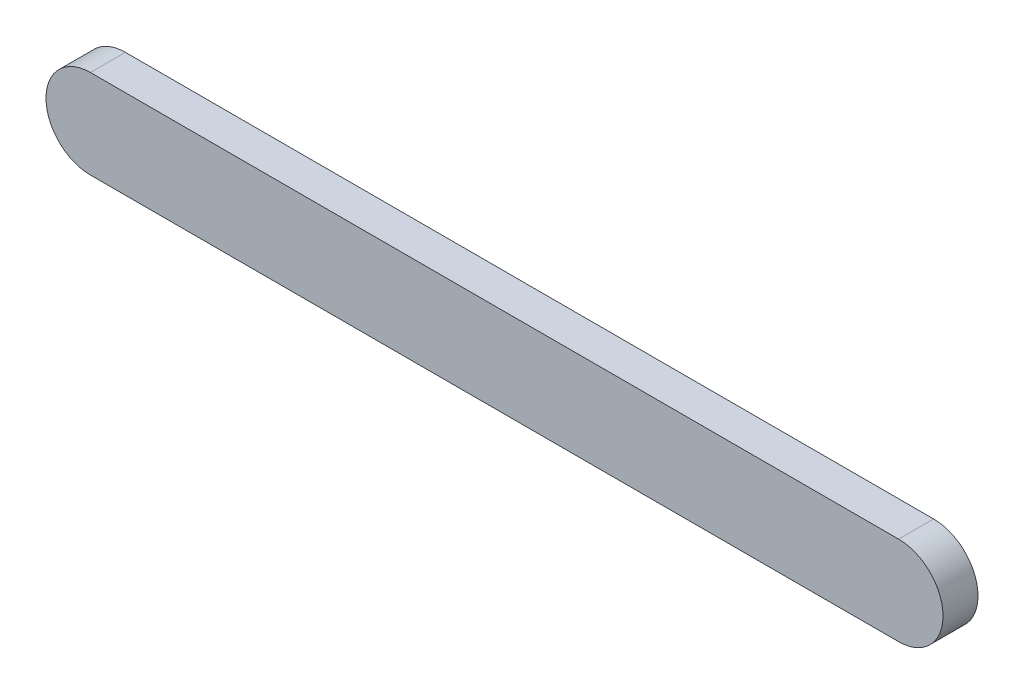
ISO-10303-21;
HEADER;
FILE_DESCRIPTION(('STEP AP214'),'2;1');
FILE_NAME('part.step','',(''),(''),'','','');
FILE_SCHEMA(('AUTOMOTIVE_DESIGN { 1 0 10303 214 1 1 1 1 }'));
ENDSEC;
DATA;
#1=APPLICATION_CONTEXT('core data for automotive mechanical design processes');
#2=APPLICATION_PROTOCOL_DEFINITION('international standard','automotive_design',2000,#1);
#3=PRODUCT_CONTEXT('',#1,'mechanical');
#4=PRODUCT('Part','Part','',(#3));
#5=PRODUCT_RELATED_PRODUCT_CATEGORY('part','',(#4));
#6=PRODUCT_DEFINITION_FORMATION('','',#4);
#7=PRODUCT_DEFINITION_CONTEXT('part definition',#1,'design');
#8=PRODUCT_DEFINITION('design','',#6,#7);
#9=PRODUCT_DEFINITION_SHAPE('','',#8);
#10=(LENGTH_UNIT() NAMED_UNIT(*) SI_UNIT(.MILLI.,.METRE.));
#11=(NAMED_UNIT(*) PLANE_ANGLE_UNIT() SI_UNIT($,.RADIAN.));
#12=(NAMED_UNIT(*) SI_UNIT($,.STERADIAN.) SOLID_ANGLE_UNIT());
#13=UNCERTAINTY_MEASURE_WITH_UNIT(LENGTH_MEASURE(1.E-05),#10,'distance_accuracy_value','');
#14=(GEOMETRIC_REPRESENTATION_CONTEXT(3) GLOBAL_UNCERTAINTY_ASSIGNED_CONTEXT((#13)) GLOBAL_UNIT_ASSIGNED_CONTEXT((#10,
#11,#12)) REPRESENTATION_CONTEXT('',''));
#15=CARTESIAN_POINT('',(0.,0.,0.));
#16=DIRECTION('',(0.,0.,1.));
#17=DIRECTION('',(1.,0.,0.));
#18=AXIS2_PLACEMENT_3D('',#15,#16,#17);
#19=CARTESIAN_POINT('',(132.21648436,97.09550304,0.));
#20=DIRECTION('',(0.,1.,0.));
#21=DIRECTION('',(1.,0.,0.));
#22=AXIS2_PLACEMENT_3D('',#19,#20,#21);
#23=PLANE('',#22);
#24=DIRECTION('',(1.,0.,0.));
#25=VECTOR('',#24,1.);
#26=CARTESIAN_POINT('',(132.21648436,97.09550304,0.1999996));
#27=LINE('',#26,#25);
#28=CARTESIAN_POINT('',(132.21648436,97.09550304,0.1999996));
#29=VERTEX_POINT('',#28);
#30=CARTESIAN_POINT('',(136.83849696,97.09550304,0.1999996));
#31=VERTEX_POINT('',#30);
#32=EDGE_CURVE('E11',#29,#31,#27,.T.);
#33=ORIENTED_EDGE('',*,*,#32,.F.);
#34=DIRECTION('',(0.,0.,1.));
#35=VECTOR('',#34,1.);
#36=CARTESIAN_POINT('',(132.21648436,97.09550304,0.));
#37=LINE('',#36,#35);
#38=CARTESIAN_POINT('',(132.21648436,97.09550304,0.));
#39=VERTEX_POINT('',#38);
#40=EDGE_CURVE('E24',#39,#29,#37,.T.);
#41=ORIENTED_EDGE('',*,*,#40,.F.);
#42=DIRECTION('',(1.,0.,0.));
#43=VECTOR('',#42,1.);
#44=CARTESIAN_POINT('',(132.21648436,97.09550304,0.));
#45=LINE('',#44,#43);
#46=CARTESIAN_POINT('',(136.83849696,97.09550304,0.));
#47=VERTEX_POINT('',#46);
#48=EDGE_CURVE('E75',#39,#47,#45,.T.);
#49=ORIENTED_EDGE('',*,*,#48,.T.);
#50=DIRECTION('',(0.,0.,1.));
#51=VECTOR('',#50,1.);
#52=CARTESIAN_POINT('',(136.83849696,97.09550304,0.));
#53=LINE('',#52,#51);
#54=EDGE_CURVE('E37',#47,#31,#53,.T.);
#55=ORIENTED_EDGE('',*,*,#54,.T.);
#56=EDGE_LOOP('',(#33,#41,#49,#55));
#57=FACE_BOUND('',#56,.T.);
#58=ADVANCED_FACE('F17',(#57),#23,.F.);
#59=CARTESIAN_POINT('',(136.83849696,97.34950304,0.));
#60=DIRECTION('',(0.,0.,-1.));
#61=DIRECTION('',(-1.11896493820492E-13,-1.,0.));
#62=AXIS2_PLACEMENT_3D('',#59,#60,#61);
#63=CYLINDRICAL_SURFACE('',#62,0.253999999999995);
#64=CARTESIAN_POINT('',(136.83849696,97.34950304,0.1999996));
#65=DIRECTION('',(0.,0.,1.));
#66=DIRECTION('',(-1.11896493820492E-13,-1.,0.));
#67=AXIS2_PLACEMENT_3D('',#64,#65,#66);
#68=CIRCLE('',#67,0.253999999999995);
#69=CARTESIAN_POINT('',(136.83849696,97.60350304,0.1999996));
#70=VERTEX_POINT('',#69);
#71=EDGE_CURVE('E83',#31,#70,#68,.T.);
#72=ORIENTED_EDGE('',*,*,#71,.F.);
#73=ORIENTED_EDGE('',*,*,#54,.F.);
#74=CARTESIAN_POINT('',(136.83849696,97.34950304,0.));
#75=DIRECTION('',(0.,0.,1.));
#76=DIRECTION('',(-1.11896493820492E-13,-1.,0.));
#77=AXIS2_PLACEMENT_3D('',#74,#75,#76);
#78=CIRCLE('',#77,0.253999999999995);
#79=CARTESIAN_POINT('',(136.83849696,97.60350304,0.));
#80=VERTEX_POINT('',#79);
#81=EDGE_CURVE('E81',#47,#80,#78,.T.);
#82=ORIENTED_EDGE('',*,*,#81,.T.);
#83=DIRECTION('',(0.,0.,1.));
#84=VECTOR('',#83,1.);
#85=CARTESIAN_POINT('',(136.83849696,97.60350304,0.));
#86=LINE('',#85,#84);
#87=EDGE_CURVE('E67',#80,#70,#86,.T.);
#88=ORIENTED_EDGE('',*,*,#87,.T.);
#89=EDGE_LOOP('',(#72,#73,#82,#88));
#90=FACE_BOUND('',#89,.T.);
#91=ADVANCED_FACE('F89',(#90),#63,.T.);
#92=CARTESIAN_POINT('',(136.83849696,97.60350304,0.));
#93=DIRECTION('',(0.,-1.,0.));
#94=DIRECTION('',(-1.,0.,0.));
#95=AXIS2_PLACEMENT_3D('',#92,#93,#94);
#96=PLANE('',#95);
#97=DIRECTION('',(-1.,0.,0.));
#98=VECTOR('',#97,1.);
#99=CARTESIAN_POINT('',(136.83849696,97.60350304,0.1999996));
#100=LINE('',#99,#98);
#101=CARTESIAN_POINT('',(132.21648436,97.60350304,0.1999996));
#102=VERTEX_POINT('',#101);
#103=EDGE_CURVE('E71',#70,#102,#100,.T.);
#104=ORIENTED_EDGE('',*,*,#103,.F.);
#105=ORIENTED_EDGE('',*,*,#87,.F.);
#106=DIRECTION('',(-1.,0.,0.));
#107=VECTOR('',#106,1.);
#108=CARTESIAN_POINT('',(136.83849696,97.60350304,0.));
#109=LINE('',#108,#107);
#110=CARTESIAN_POINT('',(132.21648436,97.60350304,0.));
#111=VERTEX_POINT('',#110);
#112=EDGE_CURVE('E63',#80,#111,#109,.T.);
#113=ORIENTED_EDGE('',*,*,#112,.T.);
#114=DIRECTION('',(0.,0.,1.));
#115=VECTOR('',#114,1.);
#116=CARTESIAN_POINT('',(132.21648436,97.60350304,0.));
#117=LINE('',#116,#115);
#118=EDGE_CURVE('E53',#111,#102,#117,.T.);
#119=ORIENTED_EDGE('',*,*,#118,.T.);
#120=EDGE_LOOP('',(#104,#105,#113,#119));
#121=FACE_BOUND('',#120,.T.);
#122=ADVANCED_FACE('F66',(#121),#96,.F.);
#123=CARTESIAN_POINT('',(132.21648436,97.34950304,0.));
#124=DIRECTION('',(0.,0.,-1.));
#125=DIRECTION('',(1.11896493820486E-13,1.,0.));
#126=AXIS2_PLACEMENT_3D('',#123,#124,#125);
#127=CYLINDRICAL_SURFACE('',#126,0.253999999999995);
#128=CARTESIAN_POINT('',(132.21648436,97.34950304,0.1999996));
#129=DIRECTION('',(0.,0.,1.));
#130=DIRECTION('',(1.11896493820486E-13,1.,0.));
#131=AXIS2_PLACEMENT_3D('',#128,#129,#130);
#132=CIRCLE('',#131,0.253999999999995);
#133=EDGE_CURVE('E59',#102,#29,#132,.T.);
#134=ORIENTED_EDGE('',*,*,#133,.F.);
#135=ORIENTED_EDGE('',*,*,#118,.F.);
#136=CARTESIAN_POINT('',(132.21648436,97.34950304,0.));
#137=DIRECTION('',(0.,0.,1.));
#138=DIRECTION('',(1.11896493820486E-13,1.,0.));
#139=AXIS2_PLACEMENT_3D('',#136,#137,#138);
#140=CIRCLE('',#139,0.253999999999995);
#141=EDGE_CURVE('E57',#111,#39,#140,.T.);
#142=ORIENTED_EDGE('',*,*,#141,.T.);
#143=ORIENTED_EDGE('',*,*,#40,.T.);
#144=EDGE_LOOP('',(#134,#135,#142,#143));
#145=FACE_BOUND('',#144,.T.);
#146=ADVANCED_FACE('F55',(#145),#127,.T.);
#147=CARTESIAN_POINT('',(132.21648436,97.09550304,0.));
#148=DIRECTION('',(0.,0.,-1.));
#149=DIRECTION('',(-1.,0.,0.));
#150=AXIS2_PLACEMENT_3D('',#147,#148,#149);
#151=PLANE('',#150);
#152=ORIENTED_EDGE('',*,*,#141,.F.);
#153=ORIENTED_EDGE('',*,*,#112,.F.);
#154=ORIENTED_EDGE('',*,*,#81,.F.);
#155=ORIENTED_EDGE('',*,*,#48,.F.);
#156=EDGE_LOOP('',(#152,#153,#154,#155));
#157=FACE_BOUND('',#156,.T.);
#158=ADVANCED_FACE('F74',(#157),#151,.T.);
#159=CARTESIAN_POINT('',(132.21648436,97.09550304,0.1999996));
#160=DIRECTION('',(0.,0.,-1.));
#161=DIRECTION('',(-1.,0.,0.));
#162=AXIS2_PLACEMENT_3D('',#159,#160,#161);
#163=PLANE('',#162);
#164=ORIENTED_EDGE('',*,*,#32,.T.);
#165=ORIENTED_EDGE('',*,*,#71,.T.);
#166=ORIENTED_EDGE('',*,*,#103,.T.);
#167=ORIENTED_EDGE('',*,*,#133,.T.);
#168=EDGE_LOOP('',(#164,#165,#166,#167));
#169=FACE_BOUND('',#168,.T.);
#170=ADVANCED_FACE('F91',(#169),#163,.F.);
#171=CLOSED_SHELL('',(#58,#91,#122,#146,#158,#170));
#172=MANIFOLD_SOLID_BREP('B1',#171);
#173=ADVANCED_BREP_SHAPE_REPRESENTATION('',(#18,#172),#14);
#174=SHAPE_DEFINITION_REPRESENTATION(#9,#173);
ENDSEC;
END-ISO-10303-21;
